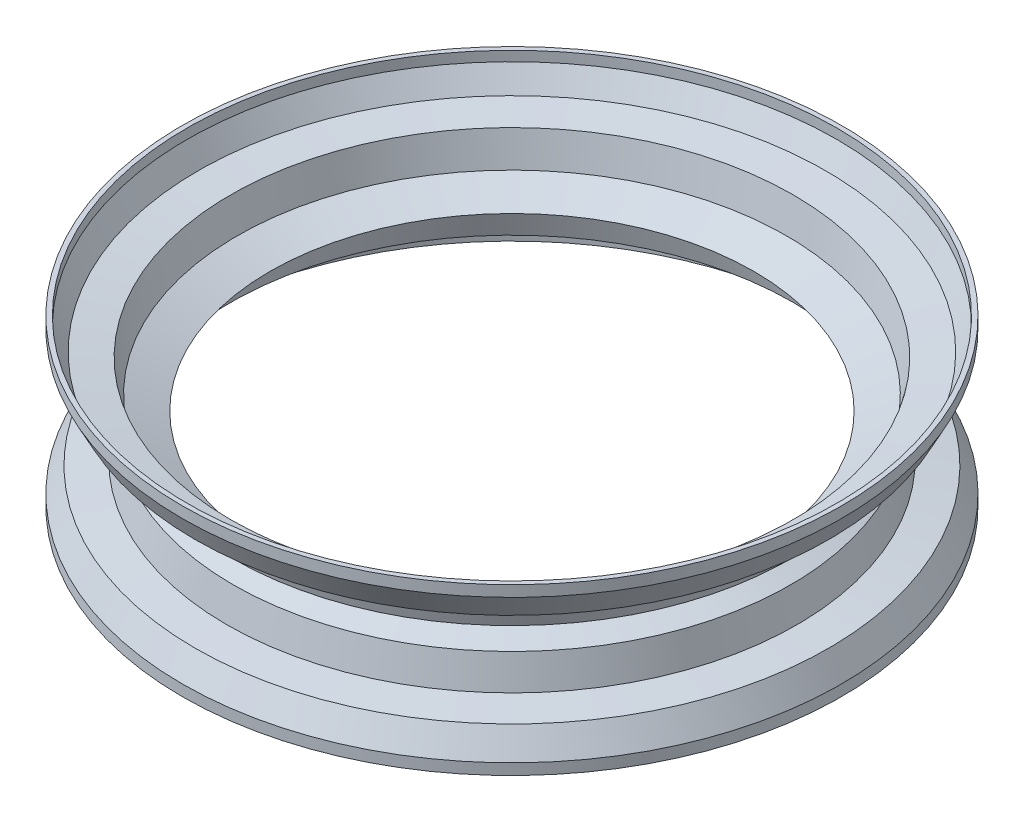
ISO-10303-21;
HEADER;
FILE_DESCRIPTION(('STEP AP214'),'2;1');
FILE_NAME('part.step','',(''),(''),'','','');
FILE_SCHEMA(('AUTOMOTIVE_DESIGN { 1 0 10303 214 1 1 1 1 }'));
ENDSEC;
DATA;
#1=APPLICATION_CONTEXT('core data for automotive mechanical design processes');
#2=APPLICATION_PROTOCOL_DEFINITION('international standard','automotive_design',2000,#1);
#3=PRODUCT_CONTEXT('',#1,'mechanical');
#4=PRODUCT('Part','Part','',(#3));
#5=PRODUCT_RELATED_PRODUCT_CATEGORY('part','',(#4));
#6=PRODUCT_DEFINITION_FORMATION('','',#4);
#7=PRODUCT_DEFINITION_CONTEXT('part definition',#1,'design');
#8=PRODUCT_DEFINITION('design','',#6,#7);
#9=PRODUCT_DEFINITION_SHAPE('','',#8);
#10=(LENGTH_UNIT() NAMED_UNIT(*) SI_UNIT(.MILLI.,.METRE.));
#11=(NAMED_UNIT(*) PLANE_ANGLE_UNIT() SI_UNIT($,.RADIAN.));
#12=(NAMED_UNIT(*) SI_UNIT($,.STERADIAN.) SOLID_ANGLE_UNIT());
#13=UNCERTAINTY_MEASURE_WITH_UNIT(LENGTH_MEASURE(1.E-05),#10,'distance_accuracy_value','');
#14=(GEOMETRIC_REPRESENTATION_CONTEXT(3) GLOBAL_UNCERTAINTY_ASSIGNED_CONTEXT((#13)) GLOBAL_UNIT_ASSIGNED_CONTEXT((#10,
#11,#12)) REPRESENTATION_CONTEXT('',''));
#15=CARTESIAN_POINT('',(0.,0.,0.));
#16=DIRECTION('',(0.,0.,1.));
#17=DIRECTION('',(1.,0.,0.));
#18=AXIS2_PLACEMENT_3D('',#15,#16,#17);
#19=CARTESIAN_POINT('',(0.,1.2,0.));
#20=DIRECTION('',(0.,-1.,0.));
#21=DIRECTION('',(0.,0.,-1.));
#22=AXIS2_PLACEMENT_3D('',#19,#20,#21);
#23=CYLINDRICAL_SURFACE('',#22,35.8938037049019);
#24=CARTESIAN_POINT('',(0.,1.2,0.));
#25=DIRECTION('',(0.,1.,0.));
#26=DIRECTION('',(0.,0.,1.));
#27=AXIS2_PLACEMENT_3D('',#24,#25,#26);
#28=CIRCLE('',#27,35.8938037049019);
#29=CARTESIAN_POINT('',(0.,1.2,35.8938037049019));
#30=VERTEX_POINT('',#29);
#31=EDGE_CURVE('E10',#30,#30,#28,.T.);
#32=ORIENTED_EDGE('',*,*,#31,.F.);
#33=EDGE_LOOP('',(#32));
#34=FACE_BOUND('',#33,.T.);
#35=CARTESIAN_POINT('',(0.,0.,0.));
#36=DIRECTION('',(0.,1.,0.));
#37=DIRECTION('',(0.,0.,1.));
#38=AXIS2_PLACEMENT_3D('',#35,#36,#37);
#39=CIRCLE('',#38,35.8938037049019);
#40=CARTESIAN_POINT('',(0.,0.,35.8938037049019));
#41=VERTEX_POINT('',#40);
#42=EDGE_CURVE('E40',#41,#41,#39,.T.);
#43=ORIENTED_EDGE('',*,*,#42,.T.);
#44=EDGE_LOOP('',(#43));
#45=FACE_BOUND('',#44,.T.);
#46=ADVANCED_FACE('F37',(#34,#45),#23,.T.);
#47=CARTESIAN_POINT('',(0.,0.,0.));
#48=DIRECTION('',(0.,1.,0.));
#49=DIRECTION('',(0.,0.,1.));
#50=AXIS2_PLACEMENT_3D('',#47,#48,#49);
#51=PLANE('',#50);
#52=CARTESIAN_POINT('',(0.,0.,0.));
#53=DIRECTION('',(0.,1.,0.));
#54=DIRECTION('',(0.,0.,1.));
#55=AXIS2_PLACEMENT_3D('',#52,#53,#54);
#56=CIRCLE('',#55,35.3938037049019);
#57=CARTESIAN_POINT('',(0.,0.,35.3938037049019));
#58=VERTEX_POINT('',#57);
#59=EDGE_CURVE('E93',#58,#58,#56,.T.);
#60=ORIENTED_EDGE('',*,*,#59,.T.);
#61=EDGE_LOOP('',(#60));
#62=FACE_BOUND('',#61,.T.);
#63=ORIENTED_EDGE('',*,*,#42,.F.);
#64=EDGE_LOOP('',(#63));
#65=FACE_BOUND('',#64,.T.);
#66=ADVANCED_FACE('F172',(#62,#65),#51,.F.);
#67=CARTESIAN_POINT('',(0.,3.87892344435885,0.));
#68=DIRECTION('',(0.,-1.,0.));
#69=DIRECTION('',(0.,0.,-1.));
#70=AXIS2_PLACEMENT_3D('',#67,#68,#69);
#71=CONICAL_SURFACE('',#70,34.5021344681995,0.479116377240371);
#72=ORIENTED_EDGE('',*,*,#31,.T.);
#73=EDGE_LOOP('',(#72));
#74=FACE_BOUND('',#73,.T.);
#75=CARTESIAN_POINT('',(0.,3.87892344435885,0.));
#76=DIRECTION('',(0.,1.,0.));
#77=DIRECTION('',(0.,0.,1.));
#78=AXIS2_PLACEMENT_3D('',#75,#76,#77);
#79=CIRCLE('',#78,34.5021344681995);
#80=CARTESIAN_POINT('',(0.,3.87892344435885,34.5021344681995));
#81=VERTEX_POINT('',#80);
#82=EDGE_CURVE('E49',#81,#81,#79,.T.);
#83=ORIENTED_EDGE('',*,*,#82,.F.);
#84=EDGE_LOOP('',(#83));
#85=FACE_BOUND('',#84,.T.);
#86=ADVANCED_FACE('F177',(#74,#85),#71,.T.);
#87=CARTESIAN_POINT('',(0.,4.37107655564115,0.));
#88=DIRECTION('',(0.,-1.,0.));
#89=DIRECTION('',(0.,0.,-1.));
#90=AXIS2_PLACEMENT_3D('',#87,#88,#89);
#91=CONICAL_SURFACE('',#90,31.0566795780326,1.42891483927482);
#92=ORIENTED_EDGE('',*,*,#82,.T.);
#93=EDGE_LOOP('',(#92));
#94=FACE_BOUND('',#93,.T.);
#95=CARTESIAN_POINT('',(0.,4.37107655564115,0.));
#96=DIRECTION('',(0.,1.,0.));
#97=DIRECTION('',(0.,0.,1.));
#98=AXIS2_PLACEMENT_3D('',#95,#96,#97);
#99=CIRCLE('',#98,31.0566795780326);
#100=CARTESIAN_POINT('',(0.,4.37107655564115,31.0566795780326));
#101=VERTEX_POINT('',#100);
#102=EDGE_CURVE('E54',#101,#101,#99,.T.);
#103=ORIENTED_EDGE('',*,*,#102,.F.);
#104=EDGE_LOOP('',(#103));
#105=FACE_BOUND('',#104,.T.);
#106=ADVANCED_FACE('F185',(#94,#105),#91,.T.);
#107=CARTESIAN_POINT('',(0.,7.77892344435885,0.));
#108=DIRECTION('',(0.,-1.,0.));
#109=DIRECTION('',(0.,0.,-1.));
#110=AXIS2_PLACEMENT_3D('',#107,#108,#109);
#111=CONICAL_SURFACE('',#110,30.3496055591516,0.204581336601476);
#112=ORIENTED_EDGE('',*,*,#102,.T.);
#113=EDGE_LOOP('',(#112));
#114=FACE_BOUND('',#113,.T.);
#115=CARTESIAN_POINT('',(0.,7.77892344435885,0.));
#116=DIRECTION('',(0.,1.,0.));
#117=DIRECTION('',(0.,0.,1.));
#118=AXIS2_PLACEMENT_3D('',#115,#116,#117);
#119=CIRCLE('',#118,30.3496055591516);
#120=CARTESIAN_POINT('',(0.,7.77892344435885,30.3496055591516));
#121=VERTEX_POINT('',#120);
#122=EDGE_CURVE('E58',#121,#121,#119,.T.);
#123=ORIENTED_EDGE('',*,*,#122,.F.);
#124=EDGE_LOOP('',(#123));
#125=FACE_BOUND('',#124,.T.);
#126=ADVANCED_FACE('F190',(#114,#125),#111,.T.);
#127=CARTESIAN_POINT('',(0.,9.,0.));
#128=DIRECTION('',(0.,-1.,0.));
#129=DIRECTION('',(0.,0.,-1.));
#130=AXIS2_PLACEMENT_3D('',#127,#128,#129);
#131=CONICAL_SURFACE('',#130,27.5887458868063,1.15437979863592);
#132=ORIENTED_EDGE('',*,*,#122,.T.);
#133=EDGE_LOOP('',(#132));
#134=FACE_BOUND('',#133,.T.);
#135=CARTESIAN_POINT('',(0.,9.,0.));
#136=DIRECTION('',(0.,1.,0.));
#137=DIRECTION('',(0.,0.,1.));
#138=AXIS2_PLACEMENT_3D('',#135,#136,#137);
#139=CIRCLE('',#138,27.5887458868063);
#140=CARTESIAN_POINT('',(0.,9.,27.5887458868063));
#141=VERTEX_POINT('',#140);
#142=EDGE_CURVE('E62',#141,#141,#139,.T.);
#143=ORIENTED_EDGE('',*,*,#142,.F.);
#144=EDGE_LOOP('',(#143));
#145=FACE_BOUND('',#144,.T.);
#146=ADVANCED_FACE('F194',(#134,#145),#131,.T.);
#147=CARTESIAN_POINT('',(0.,16.8,0.));
#148=DIRECTION('',(0.,1.,0.));
#149=DIRECTION('',(0.,0.,-1.));
#150=AXIS2_PLACEMENT_3D('',#147,#148,#149);
#151=CYLINDRICAL_SURFACE('',#150,35.8938037049019);
#152=CARTESIAN_POINT('',(0.,16.8,0.));
#153=DIRECTION('',(0.,1.,0.));
#154=DIRECTION('',(0.,0.,1.));
#155=AXIS2_PLACEMENT_3D('',#152,#153,#154);
#156=CIRCLE('',#155,35.8938037049019);
#157=CARTESIAN_POINT('',(0.,16.8,35.8938037049019));
#158=VERTEX_POINT('',#157);
#159=EDGE_CURVE('E66',#158,#158,#156,.T.);
#160=ORIENTED_EDGE('',*,*,#159,.T.);
#161=EDGE_LOOP('',(#160));
#162=FACE_BOUND('',#161,.T.);
#163=CARTESIAN_POINT('',(0.,18.,0.));
#164=DIRECTION('',(0.,1.,0.));
#165=DIRECTION('',(0.,0.,1.));
#166=AXIS2_PLACEMENT_3D('',#163,#164,#165);
#167=CIRCLE('',#166,35.8938037049019);
#168=CARTESIAN_POINT('',(0.,18.,35.8938037049019));
#169=VERTEX_POINT('',#168);
#170=EDGE_CURVE('E67',#169,#169,#167,.T.);
#171=ORIENTED_EDGE('',*,*,#170,.F.);
#172=EDGE_LOOP('',(#171));
#173=FACE_BOUND('',#172,.T.);
#174=ADVANCED_FACE('F198',(#162,#173),#151,.T.);
#175=CARTESIAN_POINT('',(0.,18.,0.));
#176=DIRECTION('',(0.,-1.,0.));
#177=DIRECTION('',(0.,0.,1.));
#178=AXIS2_PLACEMENT_3D('',#175,#176,#177);
#179=PLANE('',#178);
#180=CARTESIAN_POINT('',(0.,18.,0.));
#181=DIRECTION('',(0.,-1.,0.));
#182=DIRECTION('',(0.,0.,-1.));
#183=AXIS2_PLACEMENT_3D('',#180,#181,#182);
#184=CIRCLE('',#183,35.3938037049019);
#185=CARTESIAN_POINT('',(0.,18.,-35.3938037049019));
#186=VERTEX_POINT('',#185);
#187=EDGE_CURVE('E87',#186,#186,#184,.F.);
#188=ORIENTED_EDGE('',*,*,#187,.F.);
#189=EDGE_LOOP('',(#188));
#190=FACE_BOUND('',#189,.T.);
#191=ORIENTED_EDGE('',*,*,#170,.T.);
#192=EDGE_LOOP('',(#191));
#193=FACE_BOUND('',#192,.T.);
#194=ADVANCED_FACE('F202',(#190,#193),#179,.F.);
#195=CARTESIAN_POINT('',(0.,14.1210765556411,0.));
#196=DIRECTION('',(0.,1.,0.));
#197=DIRECTION('',(0.,0.,-1.));
#198=AXIS2_PLACEMENT_3D('',#195,#196,#197);
#199=CONICAL_SURFACE('',#198,34.5021344681995,0.479116377240371);
#200=ORIENTED_EDGE('',*,*,#159,.F.);
#201=EDGE_LOOP('',(#200));
#202=FACE_BOUND('',#201,.T.);
#203=CARTESIAN_POINT('',(0.,14.1210765556411,0.));
#204=DIRECTION('',(0.,1.,0.));
#205=DIRECTION('',(0.,0.,1.));
#206=AXIS2_PLACEMENT_3D('',#203,#204,#205);
#207=CIRCLE('',#206,34.5021344681995);
#208=CARTESIAN_POINT('',(0.,14.1210765556411,34.5021344681995));
#209=VERTEX_POINT('',#208);
#210=EDGE_CURVE('E71',#209,#209,#207,.T.);
#211=ORIENTED_EDGE('',*,*,#210,.T.);
#212=EDGE_LOOP('',(#211));
#213=FACE_BOUND('',#212,.T.);
#214=ADVANCED_FACE('F206',(#202,#213),#199,.T.);
#215=CARTESIAN_POINT('',(0.,13.6289234443589,0.));
#216=DIRECTION('',(0.,1.,0.));
#217=DIRECTION('',(0.,0.,-1.));
#218=AXIS2_PLACEMENT_3D('',#215,#216,#217);
#219=CONICAL_SURFACE('',#218,31.0566795780326,1.42891483927482);
#220=ORIENTED_EDGE('',*,*,#210,.F.);
#221=EDGE_LOOP('',(#220));
#222=FACE_BOUND('',#221,.T.);
#223=CARTESIAN_POINT('',(0.,13.6289234443589,0.));
#224=DIRECTION('',(0.,1.,0.));
#225=DIRECTION('',(0.,0.,1.));
#226=AXIS2_PLACEMENT_3D('',#223,#224,#225);
#227=CIRCLE('',#226,31.0566795780326);
#228=CARTESIAN_POINT('',(0.,13.6289234443589,31.0566795780326));
#229=VERTEX_POINT('',#228);
#230=EDGE_CURVE('E78',#229,#229,#227,.T.);
#231=ORIENTED_EDGE('',*,*,#230,.T.);
#232=EDGE_LOOP('',(#231));
#233=FACE_BOUND('',#232,.T.);
#234=ADVANCED_FACE('F210',(#222,#233),#219,.T.);
#235=CARTESIAN_POINT('',(0.,10.2210765556411,0.));
#236=DIRECTION('',(0.,1.,0.));
#237=DIRECTION('',(0.,0.,-1.));
#238=AXIS2_PLACEMENT_3D('',#235,#236,#237);
#239=CONICAL_SURFACE('',#238,30.3496055591516,0.204581336601476);
#240=ORIENTED_EDGE('',*,*,#230,.F.);
#241=EDGE_LOOP('',(#240));
#242=FACE_BOUND('',#241,.T.);
#243=CARTESIAN_POINT('',(0.,10.2210765556411,0.));
#244=DIRECTION('',(0.,1.,0.));
#245=DIRECTION('',(0.,0.,1.));
#246=AXIS2_PLACEMENT_3D('',#243,#244,#245);
#247=CIRCLE('',#246,30.3496055591516);
#248=CARTESIAN_POINT('',(0.,10.2210765556411,30.3496055591516));
#249=VERTEX_POINT('',#248);
#250=EDGE_CURVE('E82',#249,#249,#247,.T.);
#251=ORIENTED_EDGE('',*,*,#250,.T.);
#252=EDGE_LOOP('',(#251));
#253=FACE_BOUND('',#252,.T.);
#254=ADVANCED_FACE('F214',(#242,#253),#239,.T.);
#255=CARTESIAN_POINT('',(0.,9.,0.));
#256=DIRECTION('',(0.,1.,0.));
#257=DIRECTION('',(0.,0.,-1.));
#258=AXIS2_PLACEMENT_3D('',#255,#256,#257);
#259=CONICAL_SURFACE('',#258,27.5887458868063,1.15437979863592);
#260=ORIENTED_EDGE('',*,*,#250,.F.);
#261=EDGE_LOOP('',(#260));
#262=FACE_BOUND('',#261,.T.);
#263=ORIENTED_EDGE('',*,*,#142,.T.);
#264=EDGE_LOOP('',(#263));
#265=FACE_BOUND('',#264,.T.);
#266=ADVANCED_FACE('F217',(#262,#265),#259,.T.);
#267=CARTESIAN_POINT('',(0.,1.2,0.));
#268=DIRECTION('',(0.,-1.,0.));
#269=DIRECTION('',(0.,0.,-1.));
#270=AXIS2_PLACEMENT_3D('',#267,#268,#269);
#271=CYLINDRICAL_SURFACE('',#270,35.3938037049019);
#272=CARTESIAN_POINT('',(0.,1.0778757582529,0.));
#273=DIRECTION('',(0.,-1.,0.));
#274=DIRECTION('',(0.,0.,-1.));
#275=AXIS2_PLACEMENT_3D('',#272,#273,#274);
#276=CIRCLE('',#275,35.3938037049019);
#277=CARTESIAN_POINT('',(0.,1.0778757582529,-35.3938037049019));
#278=VERTEX_POINT('',#277);
#279=EDGE_CURVE('E86',#278,#278,#276,.F.);
#280=ORIENTED_EDGE('',*,*,#279,.T.);
#281=EDGE_LOOP('',(#280));
#282=FACE_BOUND('',#281,.T.);
#283=ORIENTED_EDGE('',*,*,#59,.F.);
#284=EDGE_LOOP('',(#283));
#285=FACE_BOUND('',#284,.T.);
#286=ADVANCED_FACE('F131',(#282,#285),#271,.F.);
#287=CARTESIAN_POINT('',(0.,3.64842583112588,0.));
#288=DIRECTION('',(0.,-1.,0.));
#289=DIRECTION('',(0.,0.,-1.));
#290=AXIS2_PLACEMENT_3D('',#287,#288,#289);
#291=CONICAL_SURFACE('',#290,34.0584331606807,0.479116377240371);
#292=ORIENTED_EDGE('',*,*,#279,.F.);
#293=EDGE_LOOP('',(#292));
#294=FACE_BOUND('',#293,.T.);
#295=CARTESIAN_POINT('',(0.,3.42029915555513,0.));
#296=DIRECTION('',(0.,1.,0.));
#297=DIRECTION('',(0.,0.,1.));
#298=AXIS2_PLACEMENT_3D('',#295,#296,#297);
#299=CIRCLE('',#298,34.176942286849);
#300=CARTESIAN_POINT('',(0.,3.42029915555513,34.176942286849));
#301=VERTEX_POINT('',#300);
#302=EDGE_CURVE('E97',#301,#301,#299,.T.);
#303=ORIENTED_EDGE('',*,*,#302,.T.);
#304=EDGE_LOOP('',(#303));
#305=FACE_BOUND('',#304,.T.);
#306=ADVANCED_FACE('F134',(#294,#305),#291,.F.);
#307=CARTESIAN_POINT('',(0.,3.87610070811147,0.));
#308=DIRECTION('',(0.,-1.,0.));
#309=DIRECTION('',(0.,0.,-1.));
#310=AXIS2_PLACEMENT_3D('',#307,#308,#309);
#311=CONICAL_SURFACE('',#310,30.985976605236,1.42891483927482);
#312=ORIENTED_EDGE('',*,*,#302,.F.);
#313=EDGE_LOOP('',(#312));
#314=FACE_BOUND('',#313,.T.);
#315=CARTESIAN_POINT('',(0.,3.92574472561126,0.));
#316=DIRECTION('',(0.,1.,0.));
#317=DIRECTION('',(0.,0.,1.));
#318=AXIS2_PLACEMENT_3D('',#315,#316,#317);
#319=CIRCLE('',#318,30.6384298378966);
#320=CARTESIAN_POINT('',(0.,3.92574472561126,30.6384298378966));
#321=VERTEX_POINT('',#320);
#322=EDGE_CURVE('E120',#321,#321,#319,.T.);
#323=ORIENTED_EDGE('',*,*,#322,.T.);
#324=EDGE_LOOP('',(#323));
#325=FACE_BOUND('',#324,.T.);
#326=ADVANCED_FACE('F137',(#314,#325),#311,.F.);
#327=CARTESIAN_POINT('',(0.,7.67734482182031,0.));
#328=DIRECTION('',(0.,-1.,0.));
#329=DIRECTION('',(0.,0.,-1.));
#330=AXIS2_PLACEMENT_3D('',#327,#328,#329);
#331=CONICAL_SURFACE('',#330,29.8600324967359,0.204581336601476);
#332=ORIENTED_EDGE('',*,*,#322,.F.);
#333=EDGE_LOOP('',(#332));
#334=FACE_BOUND('',#333,.T.);
#335=CARTESIAN_POINT('',(0.,7.42563342659715,0.));
#336=DIRECTION('',(0.,1.,0.));
#337=DIRECTION('',(0.,0.,1.));
#338=AXIS2_PLACEMENT_3D('',#335,#336,#337);
#339=CIRCLE('',#338,29.9122586071306);
#340=CARTESIAN_POINT('',(0.,7.42563342659715,29.9122586071306));
#341=VERTEX_POINT('',#340);
#342=EDGE_CURVE('E116',#341,#341,#339,.T.);
#343=ORIENTED_EDGE('',*,*,#342,.T.);
#344=EDGE_LOOP('',(#343));
#345=FACE_BOUND('',#344,.T.);
#346=ADVANCED_FACE('F143',(#334,#345),#331,.F.);
#347=CARTESIAN_POINT('',(0.,8.54272786365913,0.));
#348=DIRECTION('',(0.,-1.,0.));
#349=DIRECTION('',(0.,0.,-1.));
#350=AXIS2_PLACEMENT_3D('',#347,#348,#349);
#351=CONICAL_SURFACE('',#350,27.3865029800672,1.15437979863592);
#352=ORIENTED_EDGE('',*,*,#342,.F.);
#353=EDGE_LOOP('',(#352));
#354=FACE_BOUND('',#353,.T.);
#355=CARTESIAN_POINT('',(0.,9.,0.));
#356=DIRECTION('',(0.,1.,0.));
#357=DIRECTION('',(0.,0.,1.));
#358=AXIS2_PLACEMENT_3D('',#355,#356,#357);
#359=CIRCLE('',#358,26.3526085901714);
#360=CARTESIAN_POINT('',(0.,9.,26.3526085901714));
#361=VERTEX_POINT('',#360);
#362=EDGE_CURVE('E101',#361,#361,#359,.T.);
#363=ORIENTED_EDGE('',*,*,#362,.T.);
#364=EDGE_LOOP('',(#363));
#365=FACE_BOUND('',#364,.T.);
#366=ADVANCED_FACE('F149',(#354,#365),#351,.F.);
#367=CARTESIAN_POINT('',(0.,16.8,0.));
#368=DIRECTION('',(0.,1.,0.));
#369=DIRECTION('',(0.,0.,-1.));
#370=AXIS2_PLACEMENT_3D('',#367,#368,#369);
#371=CYLINDRICAL_SURFACE('',#370,35.3938037049019);
#372=CARTESIAN_POINT('',(0.,16.9221242417471,0.));
#373=DIRECTION('',(0.,1.,0.));
#374=DIRECTION('',(0.,0.,1.));
#375=AXIS2_PLACEMENT_3D('',#372,#373,#374);
#376=CIRCLE('',#375,35.3938037049019);
#377=CARTESIAN_POINT('',(0.,16.9221242417471,35.3938037049019));
#378=VERTEX_POINT('',#377);
#379=EDGE_CURVE('E91',#378,#378,#376,.T.);
#380=ORIENTED_EDGE('',*,*,#379,.F.);
#381=EDGE_LOOP('',(#380));
#382=FACE_BOUND('',#381,.T.);
#383=ORIENTED_EDGE('',*,*,#187,.T.);
#384=EDGE_LOOP('',(#383));
#385=FACE_BOUND('',#384,.T.);
#386=ADVANCED_FACE('F155',(#382,#385),#371,.F.);
#387=CARTESIAN_POINT('',(0.,14.3515741688741,0.));
#388=DIRECTION('',(0.,1.,0.));
#389=DIRECTION('',(0.,0.,-1.));
#390=AXIS2_PLACEMENT_3D('',#387,#388,#389);
#391=CONICAL_SURFACE('',#390,34.0584331606807,0.479116377240371);
#392=ORIENTED_EDGE('',*,*,#379,.T.);
#393=EDGE_LOOP('',(#392));
#394=FACE_BOUND('',#393,.T.);
#395=CARTESIAN_POINT('',(0.,14.5797008444449,0.));
#396=DIRECTION('',(0.,1.,0.));
#397=DIRECTION('',(0.,0.,1.));
#398=AXIS2_PLACEMENT_3D('',#395,#396,#397);
#399=CIRCLE('',#398,34.1769422868491);
#400=CARTESIAN_POINT('',(0.,14.5797008444449,34.1769422868491));
#401=VERTEX_POINT('',#400);
#402=EDGE_CURVE('E92',#401,#401,#399,.T.);
#403=ORIENTED_EDGE('',*,*,#402,.F.);
#404=EDGE_LOOP('',(#403));
#405=FACE_BOUND('',#404,.T.);
#406=ADVANCED_FACE('F235',(#394,#405),#391,.F.);
#407=CARTESIAN_POINT('',(0.,14.1238992918885,0.));
#408=DIRECTION('',(0.,1.,0.));
#409=DIRECTION('',(0.,0.,-1.));
#410=AXIS2_PLACEMENT_3D('',#407,#408,#409);
#411=CONICAL_SURFACE('',#410,30.985976605236,1.42891483927482);
#412=ORIENTED_EDGE('',*,*,#402,.T.);
#413=EDGE_LOOP('',(#412));
#414=FACE_BOUND('',#413,.T.);
#415=CARTESIAN_POINT('',(0.,14.0742552743887,0.));
#416=DIRECTION('',(0.,1.,0.));
#417=DIRECTION('',(0.,0.,1.));
#418=AXIS2_PLACEMENT_3D('',#415,#416,#417);
#419=CIRCLE('',#418,30.6384298378966);
#420=CARTESIAN_POINT('',(0.,14.0742552743887,30.6384298378966));
#421=VERTEX_POINT('',#420);
#422=EDGE_CURVE('E105',#421,#421,#419,.T.);
#423=ORIENTED_EDGE('',*,*,#422,.F.);
#424=EDGE_LOOP('',(#423));
#425=FACE_BOUND('',#424,.T.);
#426=ADVANCED_FACE('F167',(#414,#425),#411,.F.);
#427=CARTESIAN_POINT('',(0.,10.3226551781797,0.));
#428=DIRECTION('',(0.,1.,0.));
#429=DIRECTION('',(0.,0.,-1.));
#430=AXIS2_PLACEMENT_3D('',#427,#428,#429);
#431=CONICAL_SURFACE('',#430,29.8600324967359,0.204581336601476);
#432=ORIENTED_EDGE('',*,*,#422,.T.);
#433=EDGE_LOOP('',(#432));
#434=FACE_BOUND('',#433,.T.);
#435=CARTESIAN_POINT('',(0.,10.5743665734029,0.));
#436=DIRECTION('',(0.,1.,0.));
#437=DIRECTION('',(0.,0.,1.));
#438=AXIS2_PLACEMENT_3D('',#435,#436,#437);
#439=CIRCLE('',#438,29.9122586071306);
#440=CARTESIAN_POINT('',(0.,10.5743665734029,29.9122586071306));
#441=VERTEX_POINT('',#440);
#442=EDGE_CURVE('E109',#441,#441,#439,.T.);
#443=ORIENTED_EDGE('',*,*,#442,.F.);
#444=EDGE_LOOP('',(#443));
#445=FACE_BOUND('',#444,.T.);
#446=ADVANCED_FACE('F161',(#434,#445),#431,.F.);
#447=CARTESIAN_POINT('',(0.,9.45727213634086,0.));
#448=DIRECTION('',(0.,1.,0.));
#449=DIRECTION('',(0.,0.,-1.));
#450=AXIS2_PLACEMENT_3D('',#447,#448,#449);
#451=CONICAL_SURFACE('',#450,27.3865029800672,1.15437979863592);
#452=ORIENTED_EDGE('',*,*,#442,.T.);
#453=EDGE_LOOP('',(#452));
#454=FACE_BOUND('',#453,.T.);
#455=ORIENTED_EDGE('',*,*,#362,.F.);
#456=EDGE_LOOP('',(#455));
#457=FACE_BOUND('',#456,.T.);
#458=ADVANCED_FACE('F159',(#454,#457),#451,.F.);
#459=CLOSED_SHELL('',(#46,#66,#86,#106,#126,#146,#174,#194,#214,#234,#254,#266,#286,#306,#326,
#346,#366,#386,#406,#426,#446,#458));
#460=MANIFOLD_SOLID_BREP('B2',#459);
#461=ADVANCED_BREP_SHAPE_REPRESENTATION('',(#18,#460),#14);
#462=SHAPE_DEFINITION_REPRESENTATION(#9,#461);
ENDSEC;
END-ISO-10303-21;
